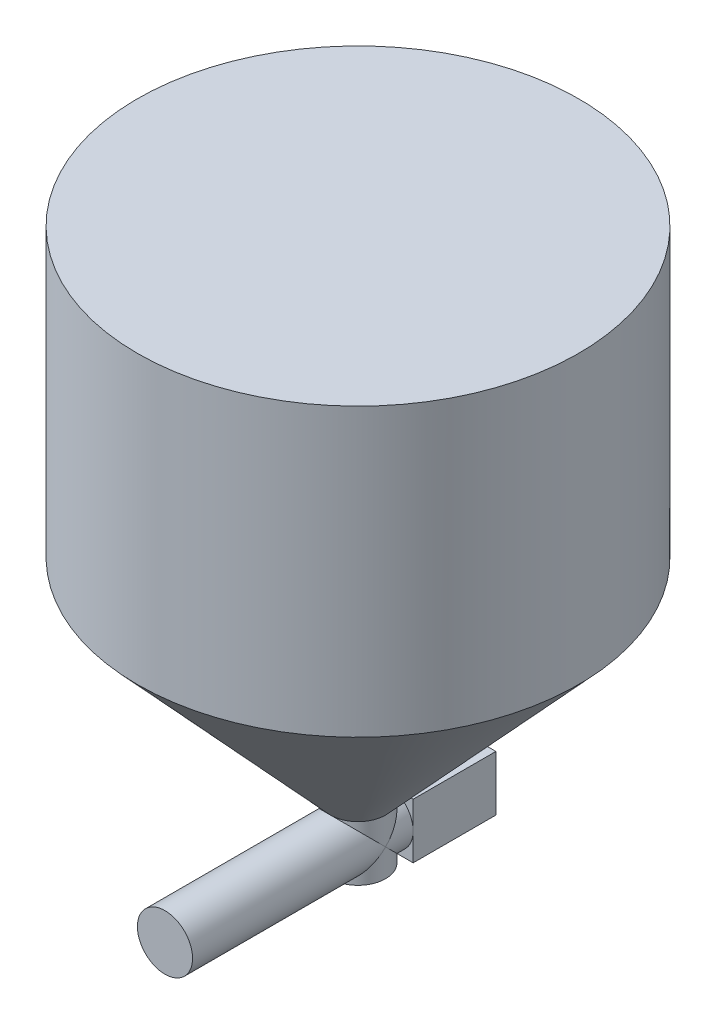
ISO-10303-21;
HEADER;
FILE_DESCRIPTION(('STEP AP214'),'2;1');
FILE_NAME('part.step','',(''),(''),'','','');
FILE_SCHEMA(('AUTOMOTIVE_DESIGN { 1 0 10303 214 1 1 1 1 }'));
ENDSEC;
DATA;
#1=APPLICATION_CONTEXT('core data for automotive mechanical design processes');
#2=APPLICATION_PROTOCOL_DEFINITION('international standard','automotive_design',2000,#1);
#3=PRODUCT_CONTEXT('',#1,'mechanical');
#4=PRODUCT('Part','Part','',(#3));
#5=PRODUCT_RELATED_PRODUCT_CATEGORY('part','',(#4));
#6=PRODUCT_DEFINITION_FORMATION('','',#4);
#7=PRODUCT_DEFINITION_CONTEXT('part definition',#1,'design');
#8=PRODUCT_DEFINITION('design','',#6,#7);
#9=PRODUCT_DEFINITION_SHAPE('','',#8);
#10=(LENGTH_UNIT() NAMED_UNIT(*) SI_UNIT(.MILLI.,.METRE.));
#11=(NAMED_UNIT(*) PLANE_ANGLE_UNIT() SI_UNIT($,.RADIAN.));
#12=(NAMED_UNIT(*) SI_UNIT($,.STERADIAN.) SOLID_ANGLE_UNIT());
#13=UNCERTAINTY_MEASURE_WITH_UNIT(LENGTH_MEASURE(1.E-05),#10,'distance_accuracy_value','');
#14=(GEOMETRIC_REPRESENTATION_CONTEXT(3) GLOBAL_UNCERTAINTY_ASSIGNED_CONTEXT((#13)) GLOBAL_UNIT_ASSIGNED_CONTEXT((#10,
#11,#12)) REPRESENTATION_CONTEXT('',''));
#15=CARTESIAN_POINT('',(0.,0.,0.));
#16=DIRECTION('',(0.,0.,1.));
#17=DIRECTION('',(1.,0.,0.));
#18=AXIS2_PLACEMENT_3D('',#15,#16,#17);
#19=CARTESIAN_POINT('',(0.,-1000.,0.));
#20=DIRECTION('',(0.,1.,0.));
#21=DIRECTION('',(0.,0.,1.));
#22=AXIS2_PLACEMENT_3D('',#19,#20,#21);
#23=CYLINDRICAL_SURFACE('',#22,50.);
#24=CARTESIAN_POINT('',(0.,-950.,0.));
#25=DIRECTION('',(0.,0.707106781186547,-0.707106781186547));
#26=DIRECTION('',(0.,0.707106781186547,0.707106781186547));
#27=AXIS2_PLACEMENT_3D('',#24,#25,#26);
#28=ELLIPSE('',#27,70.7106781186548,50.);
#29=CARTESIAN_POINT('',(-2.66453525910038E-13,-900.,50.));
#30=VERTEX_POINT('',#29);
#31=CARTESIAN_POINT('',(50.,-950.,0.));
#32=VERTEX_POINT('',#31);
#33=EDGE_CURVE('E207',#30,#32,#28,.T.);
#34=ORIENTED_EDGE('',*,*,#33,.T.);
#35=CARTESIAN_POINT('',(0.,-950.,0.));
#36=DIRECTION('',(0.,0.707106781186547,0.707106781186547));
#37=DIRECTION('',(0.,0.707106781186547,-0.707106781186547));
#38=AXIS2_PLACEMENT_3D('',#35,#36,#37);
#39=ELLIPSE('',#38,70.7106781186548,50.);
#40=CARTESIAN_POINT('',(0.,-900.,-50.));
#41=VERTEX_POINT('',#40);
#42=EDGE_CURVE('E202',#32,#41,#39,.T.);
#43=ORIENTED_EDGE('',*,*,#42,.T.);
#44=CARTESIAN_POINT('',(0.,-900.,0.));
#45=DIRECTION('',(0.,-1.,0.));
#46=DIRECTION('',(0.,0.,-1.));
#47=AXIS2_PLACEMENT_3D('',#44,#45,#46);
#48=CIRCLE('',#47,50.);
#49=EDGE_CURVE('E227',#41,#30,#48,.T.);
#50=ORIENTED_EDGE('',*,*,#49,.T.);
#51=EDGE_LOOP('',(#34,#43,#50));
#52=FACE_BOUND('',#51,.T.);
#53=ADVANCED_FACE('F37',(#52),#23,.T.);
#54=CARTESIAN_POINT('',(0.,-520.,0.));
#55=DIRECTION('',(0.,1.,0.));
#56=DIRECTION('',(0.,0.,1.));
#57=AXIS2_PLACEMENT_3D('',#54,#55,#56);
#58=CYLINDRICAL_SURFACE('',#57,400.);
#59=CARTESIAN_POINT('',(0.,-520.,0.));
#60=DIRECTION('',(0.,-1.,0.));
#61=DIRECTION('',(0.,0.,-1.));
#62=AXIS2_PLACEMENT_3D('',#59,#60,#61);
#63=CIRCLE('',#62,400.);
#64=CARTESIAN_POINT('',(0.,-520.,-400.));
#65=VERTEX_POINT('',#64);
#66=EDGE_CURVE('E47',#65,#65,#63,.T.);
#67=ORIENTED_EDGE('',*,*,#66,.F.);
#68=EDGE_LOOP('',(#67));
#69=FACE_BOUND('',#68,.T.);
#70=CARTESIAN_POINT('',(0.,0.,0.));
#71=DIRECTION('',(0.,1.,0.));
#72=DIRECTION('',(0.,0.,1.));
#73=AXIS2_PLACEMENT_3D('',#70,#71,#72);
#74=CIRCLE('',#73,400.);
#75=CARTESIAN_POINT('',(0.,0.,400.));
#76=VERTEX_POINT('',#75);
#77=EDGE_CURVE('E12',#76,#76,#74,.T.);
#78=ORIENTED_EDGE('',*,*,#77,.F.);
#79=EDGE_LOOP('',(#78));
#80=FACE_BOUND('',#79,.T.);
#81=ADVANCED_FACE('F39',(#69,#80),#58,.T.);
#82=CARTESIAN_POINT('',(0.,0.,0.));
#83=DIRECTION('',(0.,1.,0.));
#84=DIRECTION('',(0.,0.,1.));
#85=AXIS2_PLACEMENT_3D('',#82,#83,#84);
#86=PLANE('',#85);
#87=ORIENTED_EDGE('',*,*,#77,.T.);
#88=EDGE_LOOP('',(#87));
#89=FACE_BOUND('',#88,.T.);
#90=ADVANCED_FACE('F243',(#89),#86,.T.);
#91=CARTESIAN_POINT('',(0.,-900.,0.));
#92=DIRECTION('',(0.,1.,0.));
#93=DIRECTION('',(0.,0.,1.));
#94=AXIS2_PLACEMENT_3D('',#91,#92,#93);
#95=CONICAL_SURFACE('',#94,50.,0.744325384806994);
#96=ORIENTED_EDGE('',*,*,#49,.F.);
#97=CARTESIAN_POINT('',(0.,-900.,0.));
#98=DIRECTION('',(0.,-1.,0.));
#99=DIRECTION('',(0.,0.,1.));
#100=AXIS2_PLACEMENT_3D('',#97,#98,#99);
#101=CIRCLE('',#100,50.);
#102=EDGE_CURVE('E277',#30,#41,#101,.T.);
#103=ORIENTED_EDGE('',*,*,#102,.F.);
#104=EDGE_LOOP('',(#96,#103));
#105=FACE_BOUND('',#104,.T.);
#106=ORIENTED_EDGE('',*,*,#66,.T.);
#107=EDGE_LOOP('',(#106));
#108=FACE_BOUND('',#107,.T.);
#109=ADVANCED_FACE('F233',(#105,#108),#95,.T.);
#110=CARTESIAN_POINT('',(-50.,-950.,0.));
#111=VERTEX_POINT('',#110);
#112=EDGE_CURVE('E198',#41,#111,#39,.T.);
#113=ORIENTED_EDGE('',*,*,#112,.T.);
#114=EDGE_CURVE('E210',#111,#30,#28,.T.);
#115=ORIENTED_EDGE('',*,*,#114,.T.);
#116=ORIENTED_EDGE('',*,*,#102,.T.);
#117=EDGE_LOOP('',(#113,#115,#116));
#118=FACE_BOUND('',#117,.T.);
#119=ADVANCED_FACE('F242',(#118),#23,.T.);
#120=CARTESIAN_POINT('',(0.,-950.,350.));
#121=DIRECTION('',(0.,0.,-1.));
#122=DIRECTION('',(-1.,0.,0.));
#123=AXIS2_PLACEMENT_3D('',#120,#121,#122);
#124=PLANE('',#123);
#125=CARTESIAN_POINT('',(0.,-950.,350.));
#126=DIRECTION('',(0.,0.,-1.));
#127=DIRECTION('',(-1.,0.,0.));
#128=AXIS2_PLACEMENT_3D('',#125,#126,#127);
#129=CIRCLE('',#128,50.);
#130=CARTESIAN_POINT('',(-50.,-950.,350.));
#131=VERTEX_POINT('',#130);
#132=EDGE_CURVE('E188',#131,#131,#129,.T.);
#133=ORIENTED_EDGE('',*,*,#132,.F.);
#134=EDGE_LOOP('',(#133));
#135=FACE_BOUND('',#134,.T.);
#136=ADVANCED_FACE('F268',(#135),#124,.F.);
#137=CARTESIAN_POINT('',(0.,-950.,350.));
#138=DIRECTION('',(0.,0.,-1.));
#139=DIRECTION('',(-1.,0.,0.));
#140=AXIS2_PLACEMENT_3D('',#137,#138,#139);
#141=CYLINDRICAL_SURFACE('',#140,50.);
#142=ORIENTED_EDGE('',*,*,#132,.T.);
#143=EDGE_LOOP('',(#142));
#144=FACE_BOUND('',#143,.T.);
#145=CARTESIAN_POINT('',(0.,-950.,0.));
#146=DIRECTION('',(0.,0.707106781186547,0.707106781186547));
#147=DIRECTION('',(0.,0.707106781186547,-0.707106781186547));
#148=AXIS2_PLACEMENT_3D('',#145,#146,#147);
#149=ELLIPSE('',#148,70.7106781186548,50.);
#150=CARTESIAN_POINT('',(0.,-1000.,50.));
#151=VERTEX_POINT('',#150);
#152=EDGE_CURVE('E199',#32,#151,#149,.F.);
#153=ORIENTED_EDGE('',*,*,#152,.F.);
#154=ORIENTED_EDGE('',*,*,#33,.F.);
#155=ORIENTED_EDGE('',*,*,#114,.F.);
#156=EDGE_CURVE('E63',#151,#111,#149,.F.);
#157=ORIENTED_EDGE('',*,*,#156,.F.);
#158=EDGE_LOOP('',(#153,#154,#155,#157));
#159=FACE_BOUND('',#158,.T.);
#160=ADVANCED_FACE('F273',(#144,#159),#141,.T.);
#161=CARTESIAN_POINT('',(0.,-950.,0.));
#162=DIRECTION('',(0.,0.707106781186547,-0.707106781186547));
#163=DIRECTION('',(0.,0.707106781186547,0.707106781186547));
#164=AXIS2_PLACEMENT_3D('',#161,#162,#163);
#165=ELLIPSE('',#164,70.7106781186548,50.);
#166=CARTESIAN_POINT('',(0.,-1000.,-50.));
#167=VERTEX_POINT('',#166);
#168=EDGE_CURVE('E219',#111,#167,#165,.F.);
#169=ORIENTED_EDGE('',*,*,#168,.F.);
#170=ORIENTED_EDGE('',*,*,#112,.F.);
#171=CARTESIAN_POINT('',(0.,-950.,-50.));
#172=DIRECTION('',(0.,0.,-1.));
#173=DIRECTION('',(-1.,0.,0.));
#174=AXIS2_PLACEMENT_3D('',#171,#172,#173);
#175=CIRCLE('',#174,50.);
#176=CARTESIAN_POINT('',(-50.,-950.,-50.));
#177=VERTEX_POINT('',#176);
#178=EDGE_CURVE('E55',#41,#177,#175,.F.);
#179=ORIENTED_EDGE('',*,*,#178,.T.);
#180=CARTESIAN_POINT('',(0.,-950.,-50.));
#181=DIRECTION('',(0.,0.,-1.));
#182=DIRECTION('',(-1.,0.,0.));
#183=AXIS2_PLACEMENT_3D('',#180,#181,#182);
#184=CIRCLE('',#183,50.);
#185=EDGE_CURVE('E176',#167,#177,#184,.T.);
#186=ORIENTED_EDGE('',*,*,#185,.F.);
#187=EDGE_LOOP('',(#169,#170,#179,#186));
#188=FACE_BOUND('',#187,.T.);
#189=ADVANCED_FACE('F278',(#188),#141,.T.);
#190=EDGE_CURVE('E216',#167,#32,#165,.F.);
#191=ORIENTED_EDGE('',*,*,#190,.F.);
#192=CARTESIAN_POINT('',(0.,-950.,-50.));
#193=DIRECTION('',(0.,0.,-1.));
#194=DIRECTION('',(-1.,0.,0.));
#195=AXIS2_PLACEMENT_3D('',#192,#193,#194);
#196=CIRCLE('',#195,50.);
#197=CARTESIAN_POINT('',(50.,-950.,-50.));
#198=VERTEX_POINT('',#197);
#199=EDGE_CURVE('E134',#167,#198,#196,.F.);
#200=ORIENTED_EDGE('',*,*,#199,.T.);
#201=EDGE_CURVE('E178',#41,#198,#184,.T.);
#202=ORIENTED_EDGE('',*,*,#201,.F.);
#203=ORIENTED_EDGE('',*,*,#42,.F.);
#204=EDGE_LOOP('',(#191,#200,#202,#203));
#205=FACE_BOUND('',#204,.T.);
#206=ADVANCED_FACE('F265',(#205),#141,.T.);
#207=CARTESIAN_POINT('',(0.,-1000.,0.));
#208=DIRECTION('',(0.,-1.,0.));
#209=DIRECTION('',(0.,0.,-1.));
#210=AXIS2_PLACEMENT_3D('',#207,#208,#209);
#211=PLANE('',#210);
#212=CARTESIAN_POINT('',(0.,-1000.,0.));
#213=DIRECTION('',(0.,-1.,0.));
#214=DIRECTION('',(0.,0.,-1.));
#215=AXIS2_PLACEMENT_3D('',#212,#213,#214);
#216=CIRCLE('',#215,50.);
#217=EDGE_CURVE('E223',#151,#167,#216,.T.);
#218=ORIENTED_EDGE('',*,*,#217,.T.);
#219=EDGE_CURVE('E220',#167,#151,#216,.T.);
#220=ORIENTED_EDGE('',*,*,#219,.T.);
#221=EDGE_LOOP('',(#218,#220));
#222=FACE_BOUND('',#221,.T.);
#223=ADVANCED_FACE('F261',(#222),#211,.T.);
#224=ORIENTED_EDGE('',*,*,#156,.T.);
#225=ORIENTED_EDGE('',*,*,#168,.T.);
#226=ORIENTED_EDGE('',*,*,#217,.F.);
#227=EDGE_LOOP('',(#224,#225,#226));
#228=FACE_BOUND('',#227,.T.);
#229=ADVANCED_FACE('F255',(#228),#23,.T.);
#230=ORIENTED_EDGE('',*,*,#190,.T.);
#231=ORIENTED_EDGE('',*,*,#152,.T.);
#232=ORIENTED_EDGE('',*,*,#219,.F.);
#233=EDGE_LOOP('',(#230,#231,#232));
#234=FACE_BOUND('',#233,.T.);
#235=ADVANCED_FACE('F254',(#234),#23,.T.);
#236=CARTESIAN_POINT('',(0.,0.,-50.));
#237=DIRECTION('',(0.,0.,-1.));
#238=DIRECTION('',(-1.,0.,0.));
#239=AXIS2_PLACEMENT_3D('',#236,#237,#238);
#240=PLANE('',#239);
#241=ORIENTED_EDGE('',*,*,#185,.T.);
#242=DIRECTION('',(0.,1.,0.));
#243=VECTOR('',#242,1.);
#244=CARTESIAN_POINT('',(-50.,-900.,-50.));
#245=LINE('',#244,#243);
#246=CARTESIAN_POINT('',(-50.,-1000.,-50.));
#247=VERTEX_POINT('',#246);
#248=EDGE_CURVE('E145',#247,#177,#245,.T.);
#249=ORIENTED_EDGE('',*,*,#248,.F.);
#250=DIRECTION('',(-1.,0.,0.));
#251=VECTOR('',#250,1.);
#252=CARTESIAN_POINT('',(50.,-1000.,-50.));
#253=LINE('',#252,#251);
#254=EDGE_CURVE('E154',#167,#247,#253,.T.);
#255=ORIENTED_EDGE('',*,*,#254,.F.);
#256=EDGE_LOOP('',(#241,#249,#255));
#257=FACE_BOUND('',#256,.T.);
#258=ADVANCED_FACE('F175',(#257),#240,.F.);
#259=ORIENTED_EDGE('',*,*,#178,.F.);
#260=DIRECTION('',(1.,0.,0.));
#261=VECTOR('',#260,1.);
#262=CARTESIAN_POINT('',(50.,-900.,-50.));
#263=LINE('',#262,#261);
#264=CARTESIAN_POINT('',(-50.,-900.,-50.));
#265=VERTEX_POINT('',#264);
#266=EDGE_CURVE('E144',#265,#41,#263,.T.);
#267=ORIENTED_EDGE('',*,*,#266,.F.);
#268=EDGE_CURVE('E132',#177,#265,#245,.T.);
#269=ORIENTED_EDGE('',*,*,#268,.F.);
#270=EDGE_LOOP('',(#259,#267,#269));
#271=FACE_BOUND('',#270,.T.);
#272=ADVANCED_FACE('F181',(#271),#240,.F.);
#273=ORIENTED_EDGE('',*,*,#199,.F.);
#274=CARTESIAN_POINT('',(50.,-1000.,-50.));
#275=VERTEX_POINT('',#274);
#276=EDGE_CURVE('E127',#275,#167,#253,.T.);
#277=ORIENTED_EDGE('',*,*,#276,.F.);
#278=DIRECTION('',(0.,-1.,0.));
#279=VECTOR('',#278,1.);
#280=CARTESIAN_POINT('',(50.,-900.,-50.));
#281=LINE('',#280,#279);
#282=EDGE_CURVE('E155',#198,#275,#281,.T.);
#283=ORIENTED_EDGE('',*,*,#282,.F.);
#284=EDGE_LOOP('',(#273,#277,#283));
#285=FACE_BOUND('',#284,.T.);
#286=ADVANCED_FACE('F168',(#285),#240,.F.);
#287=CARTESIAN_POINT('',(-50.,-900.,-200.));
#288=DIRECTION('',(1.,0.,0.));
#289=DIRECTION('',(0.,1.,0.));
#290=AXIS2_PLACEMENT_3D('',#287,#288,#289);
#291=PLANE('',#290);
#292=ORIENTED_EDGE('',*,*,#248,.T.);
#293=ORIENTED_EDGE('',*,*,#268,.T.);
#294=DIRECTION('',(0.,0.,1.));
#295=VECTOR('',#294,1.);
#296=CARTESIAN_POINT('',(-50.,-900.,-200.));
#297=LINE('',#296,#295);
#298=CARTESIAN_POINT('',(-50.,-900.,-200.));
#299=VERTEX_POINT('',#298);
#300=EDGE_CURVE('E112',#299,#265,#297,.T.);
#301=ORIENTED_EDGE('',*,*,#300,.F.);
#302=DIRECTION('',(0.,1.,0.));
#303=VECTOR('',#302,1.);
#304=CARTESIAN_POINT('',(-50.,-900.,-200.));
#305=LINE('',#304,#303);
#306=CARTESIAN_POINT('',(-50.,-1000.,-200.));
#307=VERTEX_POINT('',#306);
#308=EDGE_CURVE('E118',#307,#299,#305,.T.);
#309=ORIENTED_EDGE('',*,*,#308,.F.);
#310=DIRECTION('',(0.,0.,1.));
#311=VECTOR('',#310,1.);
#312=CARTESIAN_POINT('',(-50.,-1000.,-200.));
#313=LINE('',#312,#311);
#314=EDGE_CURVE('E158',#307,#247,#313,.T.);
#315=ORIENTED_EDGE('',*,*,#314,.T.);
#316=EDGE_LOOP('',(#292,#293,#301,#309,#315));
#317=FACE_BOUND('',#316,.T.);
#318=ADVANCED_FACE('F130',(#317),#291,.F.);
#319=CARTESIAN_POINT('',(50.,-900.,-200.));
#320=DIRECTION('',(0.,-1.,0.));
#321=DIRECTION('',(0.,0.,-1.));
#322=AXIS2_PLACEMENT_3D('',#319,#320,#321);
#323=PLANE('',#322);
#324=ORIENTED_EDGE('',*,*,#266,.T.);
#325=CARTESIAN_POINT('',(50.,-900.,-50.));
#326=VERTEX_POINT('',#325);
#327=EDGE_CURVE('E141',#41,#326,#263,.T.);
#328=ORIENTED_EDGE('',*,*,#327,.T.);
#329=DIRECTION('',(0.,0.,1.));
#330=VECTOR('',#329,1.);
#331=CARTESIAN_POINT('',(50.,-900.,-200.));
#332=LINE('',#331,#330);
#333=CARTESIAN_POINT('',(50.,-900.,-200.));
#334=VERTEX_POINT('',#333);
#335=EDGE_CURVE('E114',#334,#326,#332,.T.);
#336=ORIENTED_EDGE('',*,*,#335,.F.);
#337=DIRECTION('',(1.,0.,0.));
#338=VECTOR('',#337,1.);
#339=CARTESIAN_POINT('',(50.,-900.,-200.));
#340=LINE('',#339,#338);
#341=EDGE_CURVE('E107',#299,#334,#340,.T.);
#342=ORIENTED_EDGE('',*,*,#341,.F.);
#343=ORIENTED_EDGE('',*,*,#300,.T.);
#344=EDGE_LOOP('',(#324,#328,#336,#342,#343));
#345=FACE_BOUND('',#344,.T.);
#346=ADVANCED_FACE('F110',(#345),#323,.F.);
#347=CARTESIAN_POINT('',(50.,-900.,-200.));
#348=DIRECTION('',(-1.,0.,0.));
#349=DIRECTION('',(0.,-1.,0.));
#350=AXIS2_PLACEMENT_3D('',#347,#348,#349);
#351=PLANE('',#350);
#352=EDGE_CURVE('E150',#326,#198,#281,.T.);
#353=ORIENTED_EDGE('',*,*,#352,.T.);
#354=ORIENTED_EDGE('',*,*,#282,.T.);
#355=DIRECTION('',(0.,0.,1.));
#356=VECTOR('',#355,1.);
#357=CARTESIAN_POINT('',(50.,-1000.,-200.));
#358=LINE('',#357,#356);
#359=CARTESIAN_POINT('',(50.,-1000.,-200.));
#360=VERTEX_POINT('',#359);
#361=EDGE_CURVE('E137',#360,#275,#358,.T.);
#362=ORIENTED_EDGE('',*,*,#361,.F.);
#363=DIRECTION('',(0.,-1.,0.));
#364=VECTOR('',#363,1.);
#365=CARTESIAN_POINT('',(50.,-900.,-200.));
#366=LINE('',#365,#364);
#367=EDGE_CURVE('E117',#334,#360,#366,.T.);
#368=ORIENTED_EDGE('',*,*,#367,.F.);
#369=ORIENTED_EDGE('',*,*,#335,.T.);
#370=EDGE_LOOP('',(#353,#354,#362,#368,#369));
#371=FACE_BOUND('',#370,.T.);
#372=ADVANCED_FACE('F183',(#371),#351,.F.);
#373=CARTESIAN_POINT('',(50.,-1000.,-200.));
#374=DIRECTION('',(0.,1.,0.));
#375=DIRECTION('',(0.,0.,1.));
#376=AXIS2_PLACEMENT_3D('',#373,#374,#375);
#377=PLANE('',#376);
#378=ORIENTED_EDGE('',*,*,#276,.T.);
#379=ORIENTED_EDGE('',*,*,#254,.T.);
#380=ORIENTED_EDGE('',*,*,#314,.F.);
#381=DIRECTION('',(-1.,0.,0.));
#382=VECTOR('',#381,1.);
#383=CARTESIAN_POINT('',(50.,-1000.,-200.));
#384=LINE('',#383,#382);
#385=EDGE_CURVE('E123',#360,#307,#384,.T.);
#386=ORIENTED_EDGE('',*,*,#385,.F.);
#387=ORIENTED_EDGE('',*,*,#361,.T.);
#388=EDGE_LOOP('',(#378,#379,#380,#386,#387));
#389=FACE_BOUND('',#388,.T.);
#390=ADVANCED_FACE('F163',(#389),#377,.F.);
#391=CARTESIAN_POINT('',(0.,0.,-200.));
#392=DIRECTION('',(0.,0.,-1.));
#393=DIRECTION('',(-1.,0.,0.));
#394=AXIS2_PLACEMENT_3D('',#391,#392,#393);
#395=PLANE('',#394);
#396=ORIENTED_EDGE('',*,*,#308,.T.);
#397=ORIENTED_EDGE('',*,*,#341,.T.);
#398=ORIENTED_EDGE('',*,*,#367,.T.);
#399=ORIENTED_EDGE('',*,*,#385,.T.);
#400=EDGE_LOOP('',(#396,#397,#398,#399));
#401=FACE_BOUND('',#400,.T.);
#402=ADVANCED_FACE('F121',(#401),#395,.T.);
#403=ORIENTED_EDGE('',*,*,#201,.T.);
#404=ORIENTED_EDGE('',*,*,#352,.F.);
#405=ORIENTED_EDGE('',*,*,#327,.F.);
#406=EDGE_LOOP('',(#403,#404,#405));
#407=FACE_BOUND('',#406,.T.);
#408=ADVANCED_FACE('F186',(#407),#240,.F.);
#409=CLOSED_SHELL('',(#53,#81,#90,#109,#119,#136,#160,#189,#206,#223,#229,#235,#258,#272,#286,
#318,#346,#372,#390,#402,#408));
#410=MANIFOLD_SOLID_BREP('B2',#409);
#411=ADVANCED_BREP_SHAPE_REPRESENTATION('',(#18,#410),#14);
#412=SHAPE_DEFINITION_REPRESENTATION(#9,#411);
ENDSEC;
END-ISO-10303-21;
